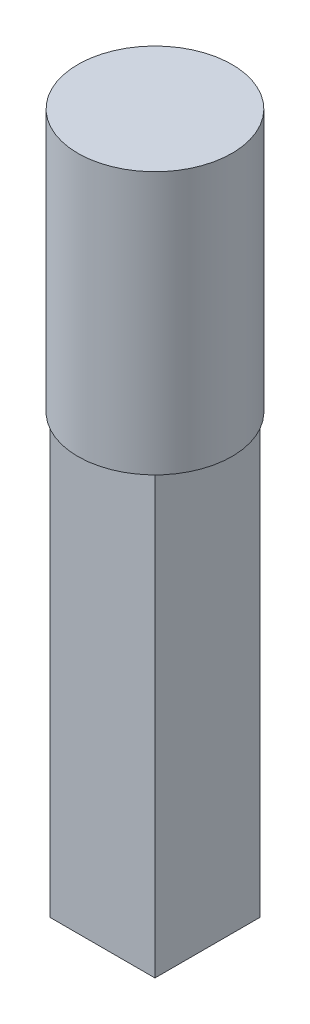
ISO-10303-21;
HEADER;
FILE_DESCRIPTION(('STEP AP214'),'2;1');
FILE_NAME('part.step','',(''),(''),'','','');
FILE_SCHEMA(('AUTOMOTIVE_DESIGN { 1 0 10303 214 1 1 1 1 }'));
ENDSEC;
DATA;
#1=APPLICATION_CONTEXT('core data for automotive mechanical design processes');
#2=APPLICATION_PROTOCOL_DEFINITION('international standard','automotive_design',2000,#1);
#3=PRODUCT_CONTEXT('',#1,'mechanical');
#4=PRODUCT('Part','Part','',(#3));
#5=PRODUCT_RELATED_PRODUCT_CATEGORY('part','',(#4));
#6=PRODUCT_DEFINITION_FORMATION('','',#4);
#7=PRODUCT_DEFINITION_CONTEXT('part definition',#1,'design');
#8=PRODUCT_DEFINITION('design','',#6,#7);
#9=PRODUCT_DEFINITION_SHAPE('','',#8);
#10=(LENGTH_UNIT() NAMED_UNIT(*) SI_UNIT(.MILLI.,.METRE.));
#11=(NAMED_UNIT(*) PLANE_ANGLE_UNIT() SI_UNIT($,.RADIAN.));
#12=(NAMED_UNIT(*) SI_UNIT($,.STERADIAN.) SOLID_ANGLE_UNIT());
#13=UNCERTAINTY_MEASURE_WITH_UNIT(LENGTH_MEASURE(1.E-05),#10,'distance_accuracy_value','');
#14=(GEOMETRIC_REPRESENTATION_CONTEXT(3) GLOBAL_UNCERTAINTY_ASSIGNED_CONTEXT((#13)) GLOBAL_UNIT_ASSIGNED_CONTEXT((#10,
#11,#12)) REPRESENTATION_CONTEXT('',''));
#15=CARTESIAN_POINT('',(0.,0.,0.));
#16=DIRECTION('',(0.,0.,1.));
#17=DIRECTION('',(1.,0.,0.));
#18=AXIS2_PLACEMENT_3D('',#15,#16,#17);
#19=CARTESIAN_POINT('',(30.,250.,-30.));
#20=DIRECTION('',(-1.,0.,0.));
#21=DIRECTION('',(0.,0.,1.));
#22=AXIS2_PLACEMENT_3D('',#19,#20,#21);
#23=PLANE('',#22);
#24=DIRECTION('',(0.,0.,-1.));
#25=VECTOR('',#24,1.);
#26=CARTESIAN_POINT('',(30.,0.,-30.));
#27=LINE('',#26,#25);
#28=CARTESIAN_POINT('',(30.,0.,30.));
#29=VERTEX_POINT('',#28);
#30=CARTESIAN_POINT('',(30.,0.,-30.));
#31=VERTEX_POINT('',#30);
#32=EDGE_CURVE('E109',#29,#31,#27,.T.);
#33=ORIENTED_EDGE('',*,*,#32,.T.);
#34=DIRECTION('',(0.,-1.,0.));
#35=VECTOR('',#34,1.);
#36=CARTESIAN_POINT('',(30.,250.,-30.));
#37=LINE('',#36,#35);
#38=CARTESIAN_POINT('',(30.,250.,-30.));
#39=VERTEX_POINT('',#38);
#40=EDGE_CURVE('E11',#39,#31,#37,.T.);
#41=ORIENTED_EDGE('',*,*,#40,.F.);
#42=DIRECTION('',(0.,0.,-1.));
#43=VECTOR('',#42,1.);
#44=CARTESIAN_POINT('',(30.,250.,-30.));
#45=LINE('',#44,#43);
#46=CARTESIAN_POINT('',(30.,250.,30.));
#47=VERTEX_POINT('',#46);
#48=EDGE_CURVE('E88',#47,#39,#45,.T.);
#49=ORIENTED_EDGE('',*,*,#48,.F.);
#50=DIRECTION('',(0.,-1.,0.));
#51=VECTOR('',#50,1.);
#52=CARTESIAN_POINT('',(30.,250.,30.));
#53=LINE('',#52,#51);
#54=EDGE_CURVE('E90',#47,#29,#53,.T.);
#55=ORIENTED_EDGE('',*,*,#54,.T.);
#56=EDGE_LOOP('',(#33,#41,#49,#55));
#57=FACE_BOUND('',#56,.T.);
#58=ADVANCED_FACE('F39',(#57),#23,.F.);
#59=CARTESIAN_POINT('',(-30.,250.,-30.));
#60=DIRECTION('',(0.,0.,1.));
#61=DIRECTION('',(1.,0.,0.));
#62=AXIS2_PLACEMENT_3D('',#59,#60,#61);
#63=PLANE('',#62);
#64=DIRECTION('',(-1.,0.,0.));
#65=VECTOR('',#64,1.);
#66=CARTESIAN_POINT('',(-30.,0.,-30.));
#67=LINE('',#66,#65);
#68=CARTESIAN_POINT('',(-30.,0.,-30.));
#69=VERTEX_POINT('',#68);
#70=EDGE_CURVE('E112',#31,#69,#67,.T.);
#71=ORIENTED_EDGE('',*,*,#70,.T.);
#72=DIRECTION('',(0.,-1.,0.));
#73=VECTOR('',#72,1.);
#74=CARTESIAN_POINT('',(-30.,250.,-30.));
#75=LINE('',#74,#73);
#76=CARTESIAN_POINT('',(-30.,250.,-30.));
#77=VERTEX_POINT('',#76);
#78=EDGE_CURVE('E48',#77,#69,#75,.T.);
#79=ORIENTED_EDGE('',*,*,#78,.F.);
#80=DIRECTION('',(-1.,0.,0.));
#81=VECTOR('',#80,1.);
#82=CARTESIAN_POINT('',(-30.,250.,-30.));
#83=LINE('',#82,#81);
#84=EDGE_CURVE('E82',#39,#77,#83,.T.);
#85=ORIENTED_EDGE('',*,*,#84,.F.);
#86=ORIENTED_EDGE('',*,*,#40,.T.);
#87=EDGE_LOOP('',(#71,#79,#85,#86));
#88=FACE_BOUND('',#87,.T.);
#89=ADVANCED_FACE('F125',(#88),#63,.F.);
#90=CARTESIAN_POINT('',(-30.,250.,-30.));
#91=DIRECTION('',(1.,0.,0.));
#92=DIRECTION('',(0.,0.,-1.));
#93=AXIS2_PLACEMENT_3D('',#90,#91,#92);
#94=PLANE('',#93);
#95=DIRECTION('',(0.,0.,1.));
#96=VECTOR('',#95,1.);
#97=CARTESIAN_POINT('',(-30.,0.,-30.));
#98=LINE('',#97,#96);
#99=CARTESIAN_POINT('',(-30.,0.,30.));
#100=VERTEX_POINT('',#99);
#101=EDGE_CURVE('E72',#69,#100,#98,.T.);
#102=ORIENTED_EDGE('',*,*,#101,.T.);
#103=DIRECTION('',(0.,-1.,0.));
#104=VECTOR('',#103,1.);
#105=CARTESIAN_POINT('',(-30.,250.,30.));
#106=LINE('',#105,#104);
#107=CARTESIAN_POINT('',(-30.,250.,30.));
#108=VERTEX_POINT('',#107);
#109=EDGE_CURVE('E56',#108,#100,#106,.T.);
#110=ORIENTED_EDGE('',*,*,#109,.F.);
#111=DIRECTION('',(0.,0.,1.));
#112=VECTOR('',#111,1.);
#113=CARTESIAN_POINT('',(-30.,250.,-30.));
#114=LINE('',#113,#112);
#115=EDGE_CURVE('E102',#77,#108,#114,.T.);
#116=ORIENTED_EDGE('',*,*,#115,.F.);
#117=ORIENTED_EDGE('',*,*,#78,.T.);
#118=EDGE_LOOP('',(#102,#110,#116,#117));
#119=FACE_BOUND('',#118,.T.);
#120=ADVANCED_FACE('F122',(#119),#94,.F.);
#121=CARTESIAN_POINT('',(-30.,250.,30.));
#122=DIRECTION('',(0.,0.,-1.));
#123=DIRECTION('',(-1.,0.,0.));
#124=AXIS2_PLACEMENT_3D('',#121,#122,#123);
#125=PLANE('',#124);
#126=DIRECTION('',(1.,0.,0.));
#127=VECTOR('',#126,1.);
#128=CARTESIAN_POINT('',(-30.,0.,30.));
#129=LINE('',#128,#127);
#130=EDGE_CURVE('E77',#100,#29,#129,.T.);
#131=ORIENTED_EDGE('',*,*,#130,.T.);
#132=ORIENTED_EDGE('',*,*,#54,.F.);
#133=DIRECTION('',(1.,0.,0.));
#134=VECTOR('',#133,1.);
#135=CARTESIAN_POINT('',(-30.,250.,30.));
#136=LINE('',#135,#134);
#137=EDGE_CURVE('E97',#108,#47,#136,.T.);
#138=ORIENTED_EDGE('',*,*,#137,.F.);
#139=ORIENTED_EDGE('',*,*,#109,.T.);
#140=EDGE_LOOP('',(#131,#132,#138,#139));
#141=FACE_BOUND('',#140,.T.);
#142=ADVANCED_FACE('F96',(#141),#125,.F.);
#143=CARTESIAN_POINT('',(0.,0.,0.));
#144=DIRECTION('',(0.,1.,0.));
#145=DIRECTION('',(0.,0.,1.));
#146=AXIS2_PLACEMENT_3D('',#143,#144,#145);
#147=PLANE('',#146);
#148=ORIENTED_EDGE('',*,*,#32,.F.);
#149=ORIENTED_EDGE('',*,*,#130,.F.);
#150=ORIENTED_EDGE('',*,*,#101,.F.);
#151=ORIENTED_EDGE('',*,*,#70,.F.);
#152=EDGE_LOOP('',(#148,#149,#150,#151));
#153=FACE_BOUND('',#152,.T.);
#154=ADVANCED_FACE('F124',(#153),#147,.F.);
#155=CARTESIAN_POINT('',(0.,250.,0.));
#156=DIRECTION('',(0.,1.,0.));
#157=DIRECTION('',(0.,0.,1.));
#158=AXIS2_PLACEMENT_3D('',#155,#156,#157);
#159=PLANE('',#158);
#160=CARTESIAN_POINT('',(0.,250.,0.));
#161=DIRECTION('',(0.,1.,0.));
#162=DIRECTION('',(0.,0.,1.));
#163=AXIS2_PLACEMENT_3D('',#160,#161,#162);
#164=CIRCLE('',#163,44.);
#165=CARTESIAN_POINT('',(0.,250.,44.));
#166=VERTEX_POINT('',#165);
#167=EDGE_CURVE('E152',#166,#166,#164,.T.);
#168=ORIENTED_EDGE('',*,*,#167,.F.);
#169=EDGE_LOOP('',(#168));
#170=FACE_BOUND('',#169,.T.);
#171=ORIENTED_EDGE('',*,*,#137,.T.);
#172=ORIENTED_EDGE('',*,*,#48,.T.);
#173=ORIENTED_EDGE('',*,*,#84,.T.);
#174=ORIENTED_EDGE('',*,*,#115,.T.);
#175=EDGE_LOOP('',(#171,#172,#173,#174));
#176=FACE_BOUND('',#175,.T.);
#177=ADVANCED_FACE('F101',(#170,#176),#159,.F.);
#178=CARTESIAN_POINT('',(0.,400.,0.));
#179=DIRECTION('',(0.,-1.,0.));
#180=DIRECTION('',(0.,0.,-1.));
#181=AXIS2_PLACEMENT_3D('',#178,#179,#180);
#182=CYLINDRICAL_SURFACE('',#181,44.);
#183=CARTESIAN_POINT('',(0.,400.,0.));
#184=DIRECTION('',(0.,1.,0.));
#185=DIRECTION('',(0.,0.,1.));
#186=AXIS2_PLACEMENT_3D('',#183,#184,#185);
#187=CIRCLE('',#186,44.);
#188=CARTESIAN_POINT('',(0.,400.,44.));
#189=VERTEX_POINT('',#188);
#190=EDGE_CURVE('E113',#189,#189,#187,.T.);
#191=ORIENTED_EDGE('',*,*,#190,.F.);
#192=EDGE_LOOP('',(#191));
#193=FACE_BOUND('',#192,.T.);
#194=ORIENTED_EDGE('',*,*,#167,.T.);
#195=EDGE_LOOP('',(#194));
#196=FACE_BOUND('',#195,.T.);
#197=ADVANCED_FACE('F137',(#193,#196),#182,.T.);
#198=CARTESIAN_POINT('',(0.,400.,0.));
#199=DIRECTION('',(0.,1.,0.));
#200=DIRECTION('',(0.,0.,1.));
#201=AXIS2_PLACEMENT_3D('',#198,#199,#200);
#202=PLANE('',#201);
#203=ORIENTED_EDGE('',*,*,#190,.T.);
#204=EDGE_LOOP('',(#203));
#205=FACE_BOUND('',#204,.T.);
#206=ADVANCED_FACE('F140',(#205),#202,.T.);
#207=CLOSED_SHELL('',(#58,#89,#120,#142,#154,#177,#197,#206));
#208=MANIFOLD_SOLID_BREP('B2',#207);
#209=ADVANCED_BREP_SHAPE_REPRESENTATION('',(#18,#208),#14);
#210=SHAPE_DEFINITION_REPRESENTATION(#9,#209);
ENDSEC;
END-ISO-10303-21;
